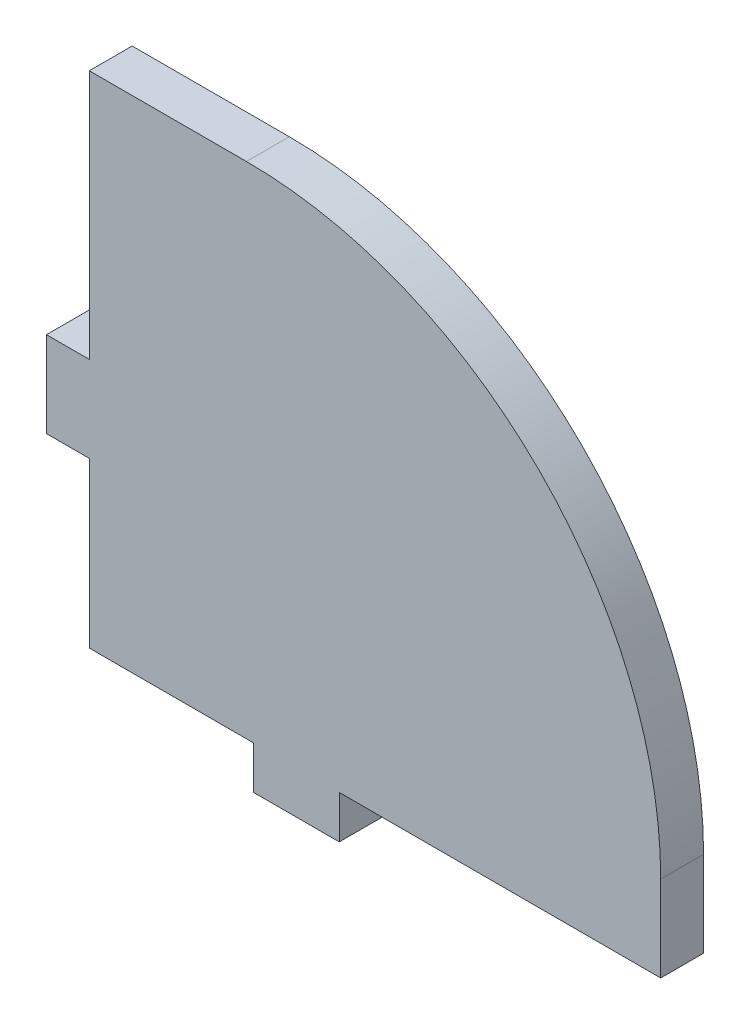
ISO-10303-21;
HEADER;
FILE_DESCRIPTION(('STEP AP214'),'2;1');
FILE_NAME('part.step','',(''),(''),'','','');
FILE_SCHEMA(('AUTOMOTIVE_DESIGN { 1 0 10303 214 1 1 1 1 }'));
ENDSEC;
DATA;
#1=APPLICATION_CONTEXT('core data for automotive mechanical design processes');
#2=APPLICATION_PROTOCOL_DEFINITION('international standard','automotive_design',2000,#1);
#3=PRODUCT_CONTEXT('',#1,'mechanical');
#4=PRODUCT('Part','Part','',(#3));
#5=PRODUCT_RELATED_PRODUCT_CATEGORY('part','',(#4));
#6=PRODUCT_DEFINITION_FORMATION('','',#4);
#7=PRODUCT_DEFINITION_CONTEXT('part definition',#1,'design');
#8=PRODUCT_DEFINITION('design','',#6,#7);
#9=PRODUCT_DEFINITION_SHAPE('','',#8);
#10=(LENGTH_UNIT() NAMED_UNIT(*) SI_UNIT(.MILLI.,.METRE.));
#11=(NAMED_UNIT(*) PLANE_ANGLE_UNIT() SI_UNIT($,.RADIAN.));
#12=(NAMED_UNIT(*) SI_UNIT($,.STERADIAN.) SOLID_ANGLE_UNIT());
#13=UNCERTAINTY_MEASURE_WITH_UNIT(LENGTH_MEASURE(1.E-05),#10,'distance_accuracy_value','');
#14=(GEOMETRIC_REPRESENTATION_CONTEXT(3) GLOBAL_UNCERTAINTY_ASSIGNED_CONTEXT((#13)) GLOBAL_UNIT_ASSIGNED_CONTEXT((#10,
#11,#12)) REPRESENTATION_CONTEXT('',''));
#15=CARTESIAN_POINT('',(0.,0.,0.));
#16=DIRECTION('',(0.,0.,1.));
#17=DIRECTION('',(1.,0.,0.));
#18=AXIS2_PLACEMENT_3D('',#15,#16,#17);
#19=CARTESIAN_POINT('',(0.,0.,3.));
#20=DIRECTION('',(1.,0.,0.));
#21=DIRECTION('',(0.,0.,-1.));
#22=AXIS2_PLACEMENT_3D('',#19,#20,#21);
#23=PLANE('',#22);
#24=DIRECTION('',(0.,-1.,0.));
#25=VECTOR('',#24,1.);
#26=CARTESIAN_POINT('',(0.,0.,0.));
#27=LINE('',#26,#25);
#28=CARTESIAN_POINT('',(0.,11.5,0.));
#29=VERTEX_POINT('',#28);
#30=CARTESIAN_POINT('',(0.,0.,0.));
#31=VERTEX_POINT('',#30);
#32=EDGE_CURVE('E258',#29,#31,#27,.T.);
#33=ORIENTED_EDGE('',*,*,#32,.T.);
#34=DIRECTION('',(0.,0.,-1.));
#35=VECTOR('',#34,1.);
#36=CARTESIAN_POINT('',(0.,0.,3.));
#37=LINE('',#36,#35);
#38=CARTESIAN_POINT('',(0.,0.,3.));
#39=VERTEX_POINT('',#38);
#40=EDGE_CURVE('E12',#39,#31,#37,.T.);
#41=ORIENTED_EDGE('',*,*,#40,.F.);
#42=DIRECTION('',(0.,-1.,0.));
#43=VECTOR('',#42,1.);
#44=CARTESIAN_POINT('',(0.,0.,3.));
#45=LINE('',#44,#43);
#46=CARTESIAN_POINT('',(0.,11.5,3.));
#47=VERTEX_POINT('',#46);
#48=EDGE_CURVE('E209',#47,#39,#45,.T.);
#49=ORIENTED_EDGE('',*,*,#48,.F.);
#50=DIRECTION('',(0.,0.,-1.));
#51=VECTOR('',#50,1.);
#52=CARTESIAN_POINT('',(0.,11.5,3.));
#53=LINE('',#52,#51);
#54=EDGE_CURVE('E160',#47,#29,#53,.T.);
#55=ORIENTED_EDGE('',*,*,#54,.T.);
#56=EDGE_LOOP('',(#33,#41,#49,#55));
#57=FACE_BOUND('',#56,.T.);
#58=ADVANCED_FACE('F35',(#57),#23,.F.);
#59=CARTESIAN_POINT('',(0.,0.,3.));
#60=DIRECTION('',(0.,1.,0.));
#61=DIRECTION('',(0.,0.,1.));
#62=AXIS2_PLACEMENT_3D('',#59,#60,#61);
#63=PLANE('',#62);
#64=DIRECTION('',(1.,0.,0.));
#65=VECTOR('',#64,1.);
#66=CARTESIAN_POINT('',(0.,0.,0.));
#67=LINE('',#66,#65);
#68=CARTESIAN_POINT('',(11.5,0.,0.));
#69=VERTEX_POINT('',#68);
#70=EDGE_CURVE('E252',#31,#69,#67,.T.);
#71=ORIENTED_EDGE('',*,*,#70,.T.);
#72=DIRECTION('',(0.,0.,-1.));
#73=VECTOR('',#72,1.);
#74=CARTESIAN_POINT('',(11.5,0.,3.));
#75=LINE('',#74,#73);
#76=CARTESIAN_POINT('',(11.5,0.,3.));
#77=VERTEX_POINT('',#76);
#78=EDGE_CURVE('E43',#77,#69,#75,.T.);
#79=ORIENTED_EDGE('',*,*,#78,.F.);
#80=DIRECTION('',(1.,0.,0.));
#81=VECTOR('',#80,1.);
#82=CARTESIAN_POINT('',(0.,0.,3.));
#83=LINE('',#82,#81);
#84=EDGE_CURVE('E109',#39,#77,#83,.T.);
#85=ORIENTED_EDGE('',*,*,#84,.F.);
#86=ORIENTED_EDGE('',*,*,#40,.T.);
#87=EDGE_LOOP('',(#71,#79,#85,#86));
#88=FACE_BOUND('',#87,.T.);
#89=ADVANCED_FACE('F289',(#88),#63,.F.);
#90=CARTESIAN_POINT('',(11.5,0.,3.));
#91=DIRECTION('',(1.,0.,0.));
#92=DIRECTION('',(0.,0.,-1.));
#93=AXIS2_PLACEMENT_3D('',#90,#91,#92);
#94=PLANE('',#93);
#95=DIRECTION('',(0.,-1.,0.));
#96=VECTOR('',#95,1.);
#97=CARTESIAN_POINT('',(11.5,0.,0.));
#98=LINE('',#97,#96);
#99=CARTESIAN_POINT('',(11.5,-3.,0.));
#100=VERTEX_POINT('',#99);
#101=EDGE_CURVE('E247',#69,#100,#98,.T.);
#102=ORIENTED_EDGE('',*,*,#101,.T.);
#103=DIRECTION('',(0.,0.,-1.));
#104=VECTOR('',#103,1.);
#105=CARTESIAN_POINT('',(11.5,-3.,3.));
#106=LINE('',#105,#104);
#107=CARTESIAN_POINT('',(11.5,-3.,3.));
#108=VERTEX_POINT('',#107);
#109=EDGE_CURVE('E239',#108,#100,#106,.T.);
#110=ORIENTED_EDGE('',*,*,#109,.F.);
#111=DIRECTION('',(0.,-1.,0.));
#112=VECTOR('',#111,1.);
#113=CARTESIAN_POINT('',(11.5,0.,3.));
#114=LINE('',#113,#112);
#115=EDGE_CURVE('E200',#77,#108,#114,.T.);
#116=ORIENTED_EDGE('',*,*,#115,.F.);
#117=ORIENTED_EDGE('',*,*,#78,.T.);
#118=EDGE_LOOP('',(#102,#110,#116,#117));
#119=FACE_BOUND('',#118,.T.);
#120=ADVANCED_FACE('F245',(#119),#94,.F.);
#121=CARTESIAN_POINT('',(11.5,-3.,3.));
#122=DIRECTION('',(0.,1.,0.));
#123=DIRECTION('',(0.,0.,1.));
#124=AXIS2_PLACEMENT_3D('',#121,#122,#123);
#125=PLANE('',#124);
#126=DIRECTION('',(1.,0.,0.));
#127=VECTOR('',#126,1.);
#128=CARTESIAN_POINT('',(11.5,-3.,0.));
#129=LINE('',#128,#127);
#130=CARTESIAN_POINT('',(17.5,-3.,0.));
#131=VERTEX_POINT('',#130);
#132=EDGE_CURVE('E254',#100,#131,#129,.T.);
#133=ORIENTED_EDGE('',*,*,#132,.T.);
#134=DIRECTION('',(0.,0.,-1.));
#135=VECTOR('',#134,1.);
#136=CARTESIAN_POINT('',(17.5,-3.,3.));
#137=LINE('',#136,#135);
#138=CARTESIAN_POINT('',(17.5,-3.,3.));
#139=VERTEX_POINT('',#138);
#140=EDGE_CURVE('E236',#139,#131,#137,.T.);
#141=ORIENTED_EDGE('',*,*,#140,.F.);
#142=DIRECTION('',(1.,0.,0.));
#143=VECTOR('',#142,1.);
#144=CARTESIAN_POINT('',(11.5,-3.,3.));
#145=LINE('',#144,#143);
#146=EDGE_CURVE('E196',#108,#139,#145,.T.);
#147=ORIENTED_EDGE('',*,*,#146,.F.);
#148=ORIENTED_EDGE('',*,*,#109,.T.);
#149=EDGE_LOOP('',(#133,#141,#147,#148));
#150=FACE_BOUND('',#149,.T.);
#151=ADVANCED_FACE('F296',(#150),#125,.F.);
#152=CARTESIAN_POINT('',(17.5,-3.,3.));
#153=DIRECTION('',(-1.,0.,0.));
#154=DIRECTION('',(0.,0.,1.));
#155=AXIS2_PLACEMENT_3D('',#152,#153,#154);
#156=PLANE('',#155);
#157=DIRECTION('',(0.,1.,0.));
#158=VECTOR('',#157,1.);
#159=CARTESIAN_POINT('',(17.5,-3.,0.));
#160=LINE('',#159,#158);
#161=CARTESIAN_POINT('',(17.5,0.,0.));
#162=VERTEX_POINT('',#161);
#163=EDGE_CURVE('E256',#131,#162,#160,.T.);
#164=ORIENTED_EDGE('',*,*,#163,.T.);
#165=DIRECTION('',(0.,0.,-1.));
#166=VECTOR('',#165,1.);
#167=CARTESIAN_POINT('',(17.5,0.,3.));
#168=LINE('',#167,#166);
#169=CARTESIAN_POINT('',(17.5,0.,3.));
#170=VERTEX_POINT('',#169);
#171=EDGE_CURVE('E233',#170,#162,#168,.T.);
#172=ORIENTED_EDGE('',*,*,#171,.F.);
#173=DIRECTION('',(0.,1.,0.));
#174=VECTOR('',#173,1.);
#175=CARTESIAN_POINT('',(17.5,-3.,3.));
#176=LINE('',#175,#174);
#177=EDGE_CURVE('E192',#139,#170,#176,.T.);
#178=ORIENTED_EDGE('',*,*,#177,.F.);
#179=ORIENTED_EDGE('',*,*,#140,.T.);
#180=EDGE_LOOP('',(#164,#172,#178,#179));
#181=FACE_BOUND('',#180,.T.);
#182=ADVANCED_FACE('F301',(#181),#156,.F.);
#183=CARTESIAN_POINT('',(17.5,0.,3.));
#184=DIRECTION('',(0.,1.,0.));
#185=DIRECTION('',(0.,0.,1.));
#186=AXIS2_PLACEMENT_3D('',#183,#184,#185);
#187=PLANE('',#186);
#188=DIRECTION('',(1.,0.,0.));
#189=VECTOR('',#188,1.);
#190=CARTESIAN_POINT('',(17.5,0.,0.));
#191=LINE('',#190,#189);
#192=CARTESIAN_POINT('',(40.,0.,0.));
#193=VERTEX_POINT('',#192);
#194=EDGE_CURVE('E262',#162,#193,#191,.T.);
#195=ORIENTED_EDGE('',*,*,#194,.T.);
#196=DIRECTION('',(0.,0.,-1.));
#197=VECTOR('',#196,1.);
#198=CARTESIAN_POINT('',(40.,0.,3.));
#199=LINE('',#198,#197);
#200=CARTESIAN_POINT('',(40.,0.,3.));
#201=VERTEX_POINT('',#200);
#202=EDGE_CURVE('E230',#201,#193,#199,.T.);
#203=ORIENTED_EDGE('',*,*,#202,.F.);
#204=DIRECTION('',(1.,0.,0.));
#205=VECTOR('',#204,1.);
#206=CARTESIAN_POINT('',(17.5,0.,3.));
#207=LINE('',#206,#205);
#208=EDGE_CURVE('E189',#170,#201,#207,.T.);
#209=ORIENTED_EDGE('',*,*,#208,.F.);
#210=ORIENTED_EDGE('',*,*,#171,.T.);
#211=EDGE_LOOP('',(#195,#203,#209,#210));
#212=FACE_BOUND('',#211,.T.);
#213=ADVANCED_FACE('F305',(#212),#187,.F.);
#214=CARTESIAN_POINT('',(40.,0.,3.));
#215=DIRECTION('',(-1.,0.,0.));
#216=DIRECTION('',(0.,0.,1.));
#217=AXIS2_PLACEMENT_3D('',#214,#215,#216);
#218=PLANE('',#217);
#219=DIRECTION('',(0.,1.,0.));
#220=VECTOR('',#219,1.);
#221=CARTESIAN_POINT('',(40.,0.,0.));
#222=LINE('',#221,#220);
#223=CARTESIAN_POINT('',(40.,5.9999999999998,0.));
#224=VERTEX_POINT('',#223);
#225=EDGE_CURVE('E264',#193,#224,#222,.T.);
#226=ORIENTED_EDGE('',*,*,#225,.T.);
#227=DIRECTION('',(0.,0.,-1.));
#228=VECTOR('',#227,1.);
#229=CARTESIAN_POINT('',(40.,5.9999999999998,3.));
#230=LINE('',#229,#228);
#231=CARTESIAN_POINT('',(40.,5.9999999999998,3.));
#232=VERTEX_POINT('',#231);
#233=EDGE_CURVE('E227',#232,#224,#230,.T.);
#234=ORIENTED_EDGE('',*,*,#233,.F.);
#235=DIRECTION('',(0.,1.,0.));
#236=VECTOR('',#235,1.);
#237=CARTESIAN_POINT('',(40.,0.,3.));
#238=LINE('',#237,#236);
#239=EDGE_CURVE('E181',#201,#232,#238,.T.);
#240=ORIENTED_EDGE('',*,*,#239,.F.);
#241=ORIENTED_EDGE('',*,*,#202,.T.);
#242=EDGE_LOOP('',(#226,#234,#240,#241));
#243=FACE_BOUND('',#242,.T.);
#244=ADVANCED_FACE('F309',(#243),#218,.F.);
#245=CARTESIAN_POINT('',(11.,6.,3.));
#246=DIRECTION('',(0.,0.,-1.));
#247=DIRECTION('',(-1.,0.,0.));
#248=AXIS2_PLACEMENT_3D('',#245,#246,#247);
#249=CYLINDRICAL_SURFACE('',#248,29.);
#250=CARTESIAN_POINT('',(11.,6.,0.));
#251=DIRECTION('',(0.,0.,1.));
#252=DIRECTION('',(-1.,0.,0.));
#253=AXIS2_PLACEMENT_3D('',#250,#251,#252);
#254=CIRCLE('',#253,29.);
#255=CARTESIAN_POINT('',(10.9999999999998,35.,0.));
#256=VERTEX_POINT('',#255);
#257=EDGE_CURVE('E266',#224,#256,#254,.T.);
#258=ORIENTED_EDGE('',*,*,#257,.T.);
#259=DIRECTION('',(0.,0.,-1.));
#260=VECTOR('',#259,1.);
#261=CARTESIAN_POINT('',(10.9999999999998,35.,3.));
#262=LINE('',#261,#260);
#263=CARTESIAN_POINT('',(10.9999999999998,35.,3.));
#264=VERTEX_POINT('',#263);
#265=EDGE_CURVE('E224',#264,#256,#262,.T.);
#266=ORIENTED_EDGE('',*,*,#265,.F.);
#267=CARTESIAN_POINT('',(11.,6.,3.));
#268=DIRECTION('',(0.,0.,1.));
#269=DIRECTION('',(-1.,0.,0.));
#270=AXIS2_PLACEMENT_3D('',#267,#268,#269);
#271=CIRCLE('',#270,29.);
#272=EDGE_CURVE('E177',#232,#264,#271,.T.);
#273=ORIENTED_EDGE('',*,*,#272,.F.);
#274=ORIENTED_EDGE('',*,*,#233,.T.);
#275=EDGE_LOOP('',(#258,#266,#273,#274));
#276=FACE_BOUND('',#275,.T.);
#277=ADVANCED_FACE('F313',(#276),#249,.T.);
#278=CARTESIAN_POINT('',(0.,35.,3.));
#279=DIRECTION('',(0.,-1.,0.));
#280=DIRECTION('',(0.,0.,-1.));
#281=AXIS2_PLACEMENT_3D('',#278,#279,#280);
#282=PLANE('',#281);
#283=DIRECTION('',(-1.,0.,0.));
#284=VECTOR('',#283,1.);
#285=CARTESIAN_POINT('',(0.,35.,0.));
#286=LINE('',#285,#284);
#287=CARTESIAN_POINT('',(0.,35.,0.));
#288=VERTEX_POINT('',#287);
#289=EDGE_CURVE('E268',#256,#288,#286,.T.);
#290=ORIENTED_EDGE('',*,*,#289,.T.);
#291=DIRECTION('',(0.,0.,-1.));
#292=VECTOR('',#291,1.);
#293=CARTESIAN_POINT('',(0.,35.,3.));
#294=LINE('',#293,#292);
#295=CARTESIAN_POINT('',(0.,35.,3.));
#296=VERTEX_POINT('',#295);
#297=EDGE_CURVE('E221',#296,#288,#294,.T.);
#298=ORIENTED_EDGE('',*,*,#297,.F.);
#299=DIRECTION('',(-1.,0.,0.));
#300=VECTOR('',#299,1.);
#301=CARTESIAN_POINT('',(0.,35.,3.));
#302=LINE('',#301,#300);
#303=EDGE_CURVE('E173',#264,#296,#302,.T.);
#304=ORIENTED_EDGE('',*,*,#303,.F.);
#305=ORIENTED_EDGE('',*,*,#265,.T.);
#306=EDGE_LOOP('',(#290,#298,#304,#305));
#307=FACE_BOUND('',#306,.T.);
#308=ADVANCED_FACE('F317',(#307),#282,.F.);
#309=CARTESIAN_POINT('',(0.,17.5,3.));
#310=DIRECTION('',(1.,0.,0.));
#311=DIRECTION('',(0.,0.,-1.));
#312=AXIS2_PLACEMENT_3D('',#309,#310,#311);
#313=PLANE('',#312);
#314=DIRECTION('',(0.,-1.,0.));
#315=VECTOR('',#314,1.);
#316=CARTESIAN_POINT('',(0.,17.5,0.));
#317=LINE('',#316,#315);
#318=CARTESIAN_POINT('',(0.,17.5,0.));
#319=VERTEX_POINT('',#318);
#320=EDGE_CURVE('E270',#288,#319,#317,.T.);
#321=ORIENTED_EDGE('',*,*,#320,.T.);
#322=DIRECTION('',(0.,0.,-1.));
#323=VECTOR('',#322,1.);
#324=CARTESIAN_POINT('',(0.,17.5,3.));
#325=LINE('',#324,#323);
#326=CARTESIAN_POINT('',(0.,17.5,3.));
#327=VERTEX_POINT('',#326);
#328=EDGE_CURVE('E153',#327,#319,#325,.T.);
#329=ORIENTED_EDGE('',*,*,#328,.F.);
#330=DIRECTION('',(0.,-1.,0.));
#331=VECTOR('',#330,1.);
#332=CARTESIAN_POINT('',(0.,17.5,3.));
#333=LINE('',#332,#331);
#334=EDGE_CURVE('E143',#296,#327,#333,.T.);
#335=ORIENTED_EDGE('',*,*,#334,.F.);
#336=ORIENTED_EDGE('',*,*,#297,.T.);
#337=EDGE_LOOP('',(#321,#329,#335,#336));
#338=FACE_BOUND('',#337,.T.);
#339=ADVANCED_FACE('F273',(#338),#313,.F.);
#340=CARTESIAN_POINT('',(0.,17.5,3.));
#341=DIRECTION('',(0.,-1.,0.));
#342=DIRECTION('',(1.,0.,0.));
#343=AXIS2_PLACEMENT_3D('',#340,#341,#342);
#344=PLANE('',#343);
#345=DIRECTION('',(-1.,0.,0.));
#346=VECTOR('',#345,1.);
#347=CARTESIAN_POINT('',(0.,17.5,0.));
#348=LINE('',#347,#346);
#349=CARTESIAN_POINT('',(-3.,17.5,0.));
#350=VERTEX_POINT('',#349);
#351=EDGE_CURVE('E152',#319,#350,#348,.T.);
#352=ORIENTED_EDGE('',*,*,#351,.T.);
#353=DIRECTION('',(0.,0.,-1.));
#354=VECTOR('',#353,1.);
#355=CARTESIAN_POINT('',(-3.,17.5,3.));
#356=LINE('',#355,#354);
#357=CARTESIAN_POINT('',(-3.,17.5,3.));
#358=VERTEX_POINT('',#357);
#359=EDGE_CURVE('E149',#358,#350,#356,.T.);
#360=ORIENTED_EDGE('',*,*,#359,.F.);
#361=DIRECTION('',(-1.,0.,0.));
#362=VECTOR('',#361,1.);
#363=CARTESIAN_POINT('',(0.,17.5,3.));
#364=LINE('',#363,#362);
#365=EDGE_CURVE('E137',#327,#358,#364,.T.);
#366=ORIENTED_EDGE('',*,*,#365,.F.);
#367=ORIENTED_EDGE('',*,*,#328,.T.);
#368=EDGE_LOOP('',(#352,#360,#366,#367));
#369=FACE_BOUND('',#368,.T.);
#370=ADVANCED_FACE('F150',(#369),#344,.F.);
#371=CARTESIAN_POINT('',(-3.,17.5,3.));
#372=DIRECTION('',(1.,0.,0.));
#373=DIRECTION('',(0.,1.,0.));
#374=AXIS2_PLACEMENT_3D('',#371,#372,#373);
#375=PLANE('',#374);
#376=DIRECTION('',(0.,-1.,0.));
#377=VECTOR('',#376,1.);
#378=CARTESIAN_POINT('',(-3.,17.5,0.));
#379=LINE('',#378,#377);
#380=CARTESIAN_POINT('',(-3.,11.5,0.));
#381=VERTEX_POINT('',#380);
#382=EDGE_CURVE('E95',#350,#381,#379,.T.);
#383=ORIENTED_EDGE('',*,*,#382,.T.);
#384=DIRECTION('',(0.,0.,-1.));
#385=VECTOR('',#384,1.);
#386=CARTESIAN_POINT('',(-3.,11.5,3.));
#387=LINE('',#386,#385);
#388=CARTESIAN_POINT('',(-3.,11.5,3.));
#389=VERTEX_POINT('',#388);
#390=EDGE_CURVE('E154',#389,#381,#387,.T.);
#391=ORIENTED_EDGE('',*,*,#390,.F.);
#392=DIRECTION('',(0.,-1.,0.));
#393=VECTOR('',#392,1.);
#394=CARTESIAN_POINT('',(-3.,17.5,3.));
#395=LINE('',#394,#393);
#396=EDGE_CURVE('E141',#358,#389,#395,.T.);
#397=ORIENTED_EDGE('',*,*,#396,.F.);
#398=ORIENTED_EDGE('',*,*,#359,.T.);
#399=EDGE_LOOP('',(#383,#391,#397,#398));
#400=FACE_BOUND('',#399,.T.);
#401=ADVANCED_FACE('F156',(#400),#375,.F.);
#402=CARTESIAN_POINT('',(-3.,11.5,3.));
#403=DIRECTION('',(0.,1.,0.));
#404=DIRECTION('',(0.,0.,1.));
#405=AXIS2_PLACEMENT_3D('',#402,#403,#404);
#406=PLANE('',#405);
#407=DIRECTION('',(1.,0.,0.));
#408=VECTOR('',#407,1.);
#409=CARTESIAN_POINT('',(-3.,11.5,0.));
#410=LINE('',#409,#408);
#411=EDGE_CURVE('E101',#381,#29,#410,.T.);
#412=ORIENTED_EDGE('',*,*,#411,.T.);
#413=ORIENTED_EDGE('',*,*,#54,.F.);
#414=DIRECTION('',(1.,0.,0.));
#415=VECTOR('',#414,1.);
#416=CARTESIAN_POINT('',(-3.,11.5,3.));
#417=LINE('',#416,#415);
#418=EDGE_CURVE('E51',#389,#47,#417,.T.);
#419=ORIENTED_EDGE('',*,*,#418,.F.);
#420=ORIENTED_EDGE('',*,*,#390,.T.);
#421=EDGE_LOOP('',(#412,#413,#419,#420));
#422=FACE_BOUND('',#421,.T.);
#423=ADVANCED_FACE('F278',(#422),#406,.F.);
#424=CARTESIAN_POINT('',(11.,6.,3.));
#425=DIRECTION('',(0.,0.,-1.));
#426=DIRECTION('',(-1.,0.,0.));
#427=AXIS2_PLACEMENT_3D('',#424,#425,#426);
#428=PLANE('',#427);
#429=ORIENTED_EDGE('',*,*,#48,.T.);
#430=ORIENTED_EDGE('',*,*,#84,.T.);
#431=ORIENTED_EDGE('',*,*,#115,.T.);
#432=ORIENTED_EDGE('',*,*,#146,.T.);
#433=ORIENTED_EDGE('',*,*,#177,.T.);
#434=ORIENTED_EDGE('',*,*,#208,.T.);
#435=ORIENTED_EDGE('',*,*,#239,.T.);
#436=ORIENTED_EDGE('',*,*,#272,.T.);
#437=ORIENTED_EDGE('',*,*,#303,.T.);
#438=ORIENTED_EDGE('',*,*,#334,.T.);
#439=ORIENTED_EDGE('',*,*,#365,.T.);
#440=ORIENTED_EDGE('',*,*,#396,.T.);
#441=ORIENTED_EDGE('',*,*,#418,.T.);
#442=EDGE_LOOP('',(#429,#430,#431,#432,#433,#434,#435,#436,#437,#438,#439,#440,#441));
#443=FACE_BOUND('',#442,.T.);
#444=ADVANCED_FACE('F139',(#443),#428,.F.);
#445=CARTESIAN_POINT('',(11.,6.,0.));
#446=DIRECTION('',(0.,0.,-1.));
#447=DIRECTION('',(-1.,0.,0.));
#448=AXIS2_PLACEMENT_3D('',#445,#446,#447);
#449=PLANE('',#448);
#450=ORIENTED_EDGE('',*,*,#32,.F.);
#451=ORIENTED_EDGE('',*,*,#411,.F.);
#452=ORIENTED_EDGE('',*,*,#382,.F.);
#453=ORIENTED_EDGE('',*,*,#351,.F.);
#454=ORIENTED_EDGE('',*,*,#320,.F.);
#455=ORIENTED_EDGE('',*,*,#289,.F.);
#456=ORIENTED_EDGE('',*,*,#257,.F.);
#457=ORIENTED_EDGE('',*,*,#225,.F.);
#458=ORIENTED_EDGE('',*,*,#194,.F.);
#459=ORIENTED_EDGE('',*,*,#163,.F.);
#460=ORIENTED_EDGE('',*,*,#132,.F.);
#461=ORIENTED_EDGE('',*,*,#101,.F.);
#462=ORIENTED_EDGE('',*,*,#70,.F.);
#463=EDGE_LOOP('',(#450,#451,#452,#453,#454,#455,#456,#457,#458,#459,#460,#461,#462));
#464=FACE_BOUND('',#463,.T.);
#465=ADVANCED_FACE('F251',(#464),#449,.T.);
#466=CLOSED_SHELL('',(#58,#89,#120,#151,#182,#213,#244,#277,#308,#339,#370,#401,#423,#444,#465));
#467=MANIFOLD_SOLID_BREP('B2',#466);
#468=ADVANCED_BREP_SHAPE_REPRESENTATION('',(#18,#467),#14);
#469=SHAPE_DEFINITION_REPRESENTATION(#9,#468);
ENDSEC;
END-ISO-10303-21;
